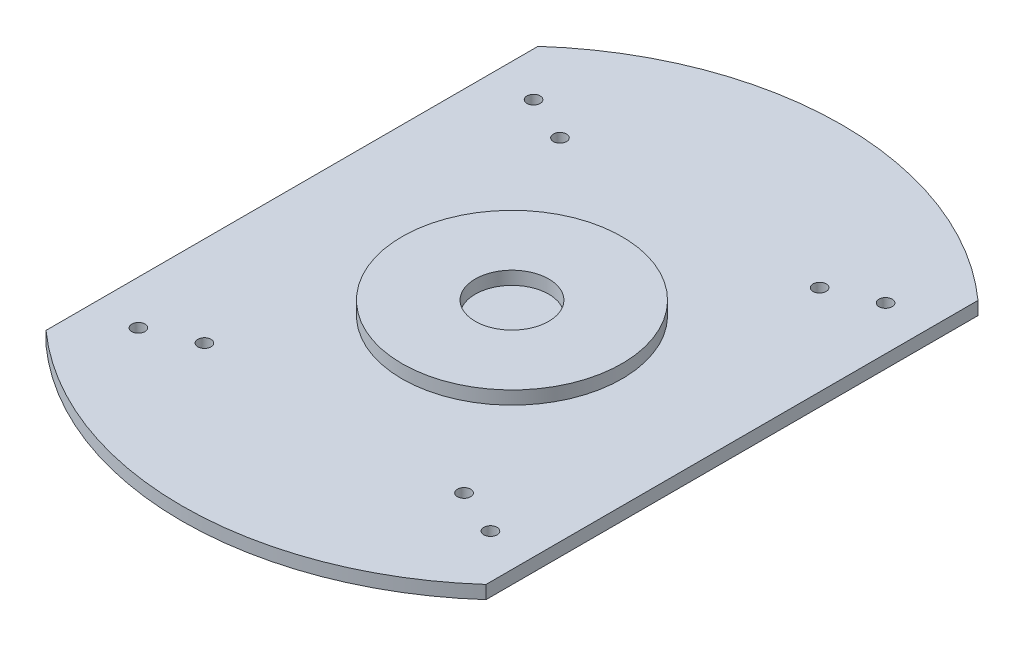
ISO-10303-21;
HEADER;
FILE_DESCRIPTION(('STEP AP214'),'2;1');
FILE_NAME('part.step','',(''),(''),'','','');
FILE_SCHEMA(('AUTOMOTIVE_DESIGN { 1 0 10303 214 1 1 1 1 }'));
ENDSEC;
DATA;
#1=APPLICATION_CONTEXT('core data for automotive mechanical design processes');
#2=APPLICATION_PROTOCOL_DEFINITION('international standard','automotive_design',2000,#1);
#3=PRODUCT_CONTEXT('',#1,'mechanical');
#4=PRODUCT('Part','Part','',(#3));
#5=PRODUCT_RELATED_PRODUCT_CATEGORY('part','',(#4));
#6=PRODUCT_DEFINITION_FORMATION('','',#4);
#7=PRODUCT_DEFINITION_CONTEXT('part definition',#1,'design');
#8=PRODUCT_DEFINITION('design','',#6,#7);
#9=PRODUCT_DEFINITION_SHAPE('','',#8);
#10=(LENGTH_UNIT() NAMED_UNIT(*) SI_UNIT(.MILLI.,.METRE.));
#11=(NAMED_UNIT(*) PLANE_ANGLE_UNIT() SI_UNIT($,.RADIAN.));
#12=(NAMED_UNIT(*) SI_UNIT($,.STERADIAN.) SOLID_ANGLE_UNIT());
#13=UNCERTAINTY_MEASURE_WITH_UNIT(LENGTH_MEASURE(1.E-05),#10,'distance_accuracy_value','');
#14=(GEOMETRIC_REPRESENTATION_CONTEXT(3) GLOBAL_UNCERTAINTY_ASSIGNED_CONTEXT((#13)) GLOBAL_UNIT_ASSIGNED_CONTEXT((#10,
#11,#12)) REPRESENTATION_CONTEXT('',''));
#15=CARTESIAN_POINT('',(0.,0.,0.));
#16=DIRECTION('',(0.,0.,1.));
#17=DIRECTION('',(1.,0.,0.));
#18=AXIS2_PLACEMENT_3D('',#15,#16,#17);
#19=CARTESIAN_POINT('',(50.,3.,0.));
#20=DIRECTION('',(-1.,0.,0.));
#21=DIRECTION('',(0.,0.,1.));
#22=AXIS2_PLACEMENT_3D('',#19,#20,#21);
#23=PLANE('',#22);
#24=DIRECTION('',(0.,0.,-1.));
#25=VECTOR('',#24,1.);
#26=CARTESIAN_POINT('',(50.,0.,0.));
#27=LINE('',#26,#25);
#28=CARTESIAN_POINT('',(50.,0.,55.9016994374947));
#29=VERTEX_POINT('',#28);
#30=CARTESIAN_POINT('',(50.,0.,-55.9016994374947));
#31=VERTEX_POINT('',#30);
#32=EDGE_CURVE('E148',#29,#31,#27,.T.);
#33=ORIENTED_EDGE('',*,*,#32,.T.);
#34=DIRECTION('',(0.,-1.,0.));
#35=VECTOR('',#34,1.);
#36=CARTESIAN_POINT('',(50.,3.,-55.9016994374947));
#37=LINE('',#36,#35);
#38=CARTESIAN_POINT('',(50.,3.,-55.9016994374947));
#39=VERTEX_POINT('',#38);
#40=EDGE_CURVE('E53',#39,#31,#37,.T.);
#41=ORIENTED_EDGE('',*,*,#40,.F.);
#42=DIRECTION('',(0.,0.,-1.));
#43=VECTOR('',#42,1.);
#44=CARTESIAN_POINT('',(50.,3.,0.));
#45=LINE('',#44,#43);
#46=CARTESIAN_POINT('',(50.,3.,55.9016994374947));
#47=VERTEX_POINT('',#46);
#48=EDGE_CURVE('E94',#47,#39,#45,.T.);
#49=ORIENTED_EDGE('',*,*,#48,.F.);
#50=DIRECTION('',(0.,-1.,0.));
#51=VECTOR('',#50,1.);
#52=CARTESIAN_POINT('',(50.,3.,55.9016994374947));
#53=LINE('',#52,#51);
#54=EDGE_CURVE('E122',#47,#29,#53,.T.);
#55=ORIENTED_EDGE('',*,*,#54,.T.);
#56=EDGE_LOOP('',(#33,#41,#49,#55));
#57=FACE_BOUND('',#56,.T.);
#58=ADVANCED_FACE('F43',(#57),#23,.F.);
#59=CARTESIAN_POINT('',(0.,3.,0.));
#60=DIRECTION('',(0.,-1.,0.));
#61=DIRECTION('',(0.,0.,-1.));
#62=AXIS2_PLACEMENT_3D('',#59,#60,#61);
#63=CYLINDRICAL_SURFACE('',#62,75.);
#64=CARTESIAN_POINT('',(0.,0.,0.));
#65=DIRECTION('',(0.,1.,0.));
#66=DIRECTION('',(0.,0.,1.));
#67=AXIS2_PLACEMENT_3D('',#64,#65,#66);
#68=CIRCLE('',#67,75.);
#69=CARTESIAN_POINT('',(-50.,0.,-55.9016994374947));
#70=VERTEX_POINT('',#69);
#71=EDGE_CURVE('E101',#31,#70,#68,.T.);
#72=ORIENTED_EDGE('',*,*,#71,.T.);
#73=DIRECTION('',(0.,-1.,0.));
#74=VECTOR('',#73,1.);
#75=CARTESIAN_POINT('',(-50.,3.,-55.9016994374947));
#76=LINE('',#75,#74);
#77=CARTESIAN_POINT('',(-50.,3.,-55.9016994374947));
#78=VERTEX_POINT('',#77);
#79=EDGE_CURVE('E99',#78,#70,#76,.T.);
#80=ORIENTED_EDGE('',*,*,#79,.F.);
#81=CARTESIAN_POINT('',(0.,3.,0.));
#82=DIRECTION('',(0.,1.,0.));
#83=DIRECTION('',(0.,0.,1.));
#84=AXIS2_PLACEMENT_3D('',#81,#82,#83);
#85=CIRCLE('',#84,75.);
#86=EDGE_CURVE('E88',#39,#78,#85,.T.);
#87=ORIENTED_EDGE('',*,*,#86,.F.);
#88=ORIENTED_EDGE('',*,*,#40,.T.);
#89=EDGE_LOOP('',(#72,#80,#87,#88));
#90=FACE_BOUND('',#89,.T.);
#91=ADVANCED_FACE('F100',(#90),#63,.T.);
#92=CARTESIAN_POINT('',(-50.,3.,0.));
#93=DIRECTION('',(-1.,0.,0.));
#94=DIRECTION('',(0.,0.,1.));
#95=AXIS2_PLACEMENT_3D('',#92,#93,#94);
#96=PLANE('',#95);
#97=DIRECTION('',(0.,0.,-1.));
#98=VECTOR('',#97,1.);
#99=CARTESIAN_POINT('',(-50.,0.,0.));
#100=LINE('',#99,#98);
#101=CARTESIAN_POINT('',(-50.,0.,55.9016994374947));
#102=VERTEX_POINT('',#101);
#103=EDGE_CURVE('E154',#102,#70,#100,.T.);
#104=ORIENTED_EDGE('',*,*,#103,.F.);
#105=DIRECTION('',(0.,-1.,0.));
#106=VECTOR('',#105,1.);
#107=CARTESIAN_POINT('',(-50.,3.,55.9016994374947));
#108=LINE('',#107,#106);
#109=CARTESIAN_POINT('',(-50.,3.,55.9016994374947));
#110=VERTEX_POINT('',#109);
#111=EDGE_CURVE('E77',#110,#102,#108,.T.);
#112=ORIENTED_EDGE('',*,*,#111,.F.);
#113=DIRECTION('',(0.,0.,-1.));
#114=VECTOR('',#113,1.);
#115=CARTESIAN_POINT('',(-50.,3.,0.));
#116=LINE('',#115,#114);
#117=EDGE_CURVE('E92',#110,#78,#116,.T.);
#118=ORIENTED_EDGE('',*,*,#117,.T.);
#119=ORIENTED_EDGE('',*,*,#79,.T.);
#120=EDGE_LOOP('',(#104,#112,#118,#119));
#121=FACE_BOUND('',#120,.T.);
#122=ADVANCED_FACE('F107',(#121),#96,.T.);
#123=CARTESIAN_POINT('',(-40.,3.,-44.9));
#124=DIRECTION('',(0.,-1.,0.));
#125=DIRECTION('',(0.,0.,-1.));
#126=AXIS2_PLACEMENT_3D('',#123,#124,#125);
#127=CYLINDRICAL_SURFACE('',#126,1.5);
#128=CARTESIAN_POINT('',(-40.,3.,-44.9));
#129=DIRECTION('',(0.,1.,0.));
#130=DIRECTION('',(0.,0.,1.));
#131=AXIS2_PLACEMENT_3D('',#128,#129,#130);
#132=CIRCLE('',#131,1.5);
#133=CARTESIAN_POINT('',(-40.,3.,-43.4));
#134=VERTEX_POINT('',#133);
#135=EDGE_CURVE('E111',#134,#134,#132,.F.);
#136=ORIENTED_EDGE('',*,*,#135,.F.);
#137=EDGE_LOOP('',(#136));
#138=FACE_BOUND('',#137,.T.);
#139=CARTESIAN_POINT('',(-40.,0.,-44.9));
#140=DIRECTION('',(0.,1.,0.));
#141=DIRECTION('',(0.,0.,1.));
#142=AXIS2_PLACEMENT_3D('',#139,#140,#141);
#143=CIRCLE('',#142,1.5);
#144=CARTESIAN_POINT('',(-40.,0.,-43.4));
#145=VERTEX_POINT('',#144);
#146=EDGE_CURVE('E159',#145,#145,#143,.F.);
#147=ORIENTED_EDGE('',*,*,#146,.T.);
#148=EDGE_LOOP('',(#147));
#149=FACE_BOUND('',#148,.T.);
#150=ADVANCED_FACE('F382',(#138,#149),#127,.F.);
#151=CARTESIAN_POINT('',(0.,3.,0.));
#152=DIRECTION('',(0.,-1.,0.));
#153=DIRECTION('',(0.,0.,-1.));
#154=AXIS2_PLACEMENT_3D('',#151,#152,#153);
#155=CYLINDRICAL_SURFACE('',#154,75.);
#156=CARTESIAN_POINT('',(0.,0.,0.));
#157=DIRECTION('',(0.,1.,0.));
#158=DIRECTION('',(0.,0.,1.));
#159=AXIS2_PLACEMENT_3D('',#156,#157,#158);
#160=CIRCLE('',#159,75.);
#161=EDGE_CURVE('E80',#102,#29,#160,.T.);
#162=ORIENTED_EDGE('',*,*,#161,.T.);
#163=ORIENTED_EDGE('',*,*,#54,.F.);
#164=CARTESIAN_POINT('',(0.,3.,0.));
#165=DIRECTION('',(0.,1.,0.));
#166=DIRECTION('',(0.,0.,1.));
#167=AXIS2_PLACEMENT_3D('',#164,#165,#166);
#168=CIRCLE('',#167,75.);
#169=EDGE_CURVE('E61',#110,#47,#168,.T.);
#170=ORIENTED_EDGE('',*,*,#169,.F.);
#171=ORIENTED_EDGE('',*,*,#111,.T.);
#172=EDGE_LOOP('',(#162,#163,#170,#171));
#173=FACE_BOUND('',#172,.T.);
#174=ADVANCED_FACE('F212',(#173),#155,.T.);
#175=CARTESIAN_POINT('',(40.,3.,-44.9));
#176=DIRECTION('',(0.,-1.,0.));
#177=DIRECTION('',(0.,0.,-1.));
#178=AXIS2_PLACEMENT_3D('',#175,#176,#177);
#179=CYLINDRICAL_SURFACE('',#178,1.5);
#180=CARTESIAN_POINT('',(40.,3.,-44.9));
#181=DIRECTION('',(0.,1.,0.));
#182=DIRECTION('',(0.,0.,1.));
#183=AXIS2_PLACEMENT_3D('',#180,#181,#182);
#184=CIRCLE('',#183,1.5);
#185=CARTESIAN_POINT('',(40.,3.,-43.4));
#186=VERTEX_POINT('',#185);
#187=EDGE_CURVE('E266',#186,#186,#184,.T.);
#188=ORIENTED_EDGE('',*,*,#187,.T.);
#189=EDGE_LOOP('',(#188));
#190=FACE_BOUND('',#189,.T.);
#191=CARTESIAN_POINT('',(40.,0.,-44.9));
#192=DIRECTION('',(0.,1.,0.));
#193=DIRECTION('',(0.,0.,1.));
#194=AXIS2_PLACEMENT_3D('',#191,#192,#193);
#195=CIRCLE('',#194,1.5);
#196=CARTESIAN_POINT('',(40.,0.,-43.4));
#197=VERTEX_POINT('',#196);
#198=EDGE_CURVE('E144',#197,#197,#195,.T.);
#199=ORIENTED_EDGE('',*,*,#198,.F.);
#200=EDGE_LOOP('',(#199));
#201=FACE_BOUND('',#200,.T.);
#202=ADVANCED_FACE('F208',(#190,#201),#179,.F.);
#203=CARTESIAN_POINT('',(29.5,3.,-40.4));
#204=DIRECTION('',(0.,-1.,0.));
#205=DIRECTION('',(0.,0.,-1.));
#206=AXIS2_PLACEMENT_3D('',#203,#204,#205);
#207=CYLINDRICAL_SURFACE('',#206,1.5);
#208=CARTESIAN_POINT('',(29.5,3.,-40.4));
#209=DIRECTION('',(0.,1.,0.));
#210=DIRECTION('',(0.,0.,1.));
#211=AXIS2_PLACEMENT_3D('',#208,#209,#210);
#212=CIRCLE('',#211,1.5);
#213=CARTESIAN_POINT('',(29.5,3.,-38.9));
#214=VERTEX_POINT('',#213);
#215=EDGE_CURVE('E262',#214,#214,#212,.T.);
#216=ORIENTED_EDGE('',*,*,#215,.T.);
#217=EDGE_LOOP('',(#216));
#218=FACE_BOUND('',#217,.T.);
#219=CARTESIAN_POINT('',(29.5,0.,-40.4));
#220=DIRECTION('',(0.,1.,0.));
#221=DIRECTION('',(0.,0.,1.));
#222=AXIS2_PLACEMENT_3D('',#219,#220,#221);
#223=CIRCLE('',#222,1.5);
#224=CARTESIAN_POINT('',(29.5,0.,-38.9));
#225=VERTEX_POINT('',#224);
#226=EDGE_CURVE('E140',#225,#225,#223,.T.);
#227=ORIENTED_EDGE('',*,*,#226,.F.);
#228=EDGE_LOOP('',(#227));
#229=FACE_BOUND('',#228,.T.);
#230=ADVANCED_FACE('F211',(#218,#229),#207,.F.);
#231=CARTESIAN_POINT('',(-29.5,3.,-40.4));
#232=DIRECTION('',(0.,-1.,0.));
#233=DIRECTION('',(0.,0.,-1.));
#234=AXIS2_PLACEMENT_3D('',#231,#232,#233);
#235=CYLINDRICAL_SURFACE('',#234,1.5);
#236=CARTESIAN_POINT('',(-29.5,3.,-40.4));
#237=DIRECTION('',(0.,1.,0.));
#238=DIRECTION('',(0.,0.,1.));
#239=AXIS2_PLACEMENT_3D('',#236,#237,#238);
#240=CIRCLE('',#239,1.5);
#241=CARTESIAN_POINT('',(-29.5,3.,-38.9));
#242=VERTEX_POINT('',#241);
#243=EDGE_CURVE('E253',#242,#242,#240,.F.);
#244=ORIENTED_EDGE('',*,*,#243,.F.);
#245=EDGE_LOOP('',(#244));
#246=FACE_BOUND('',#245,.T.);
#247=CARTESIAN_POINT('',(-29.5,0.,-40.4));
#248=DIRECTION('',(0.,1.,0.));
#249=DIRECTION('',(0.,0.,1.));
#250=AXIS2_PLACEMENT_3D('',#247,#248,#249);
#251=CIRCLE('',#250,1.5);
#252=CARTESIAN_POINT('',(-29.5,0.,-38.9));
#253=VERTEX_POINT('',#252);
#254=EDGE_CURVE('E136',#253,#253,#251,.F.);
#255=ORIENTED_EDGE('',*,*,#254,.T.);
#256=EDGE_LOOP('',(#255));
#257=FACE_BOUND('',#256,.T.);
#258=ADVANCED_FACE('F216',(#246,#257),#235,.F.);
#259=CARTESIAN_POINT('',(29.5,3.,40.4));
#260=DIRECTION('',(0.,-1.,0.));
#261=DIRECTION('',(0.,0.,-1.));
#262=AXIS2_PLACEMENT_3D('',#259,#260,#261);
#263=CYLINDRICAL_SURFACE('',#262,1.5);
#264=CARTESIAN_POINT('',(29.5,3.,40.4));
#265=DIRECTION('',(0.,1.,0.));
#266=DIRECTION('',(0.,0.,1.));
#267=AXIS2_PLACEMENT_3D('',#264,#265,#266);
#268=CIRCLE('',#267,1.5);
#269=CARTESIAN_POINT('',(29.5,3.,41.9));
#270=VERTEX_POINT('',#269);
#271=EDGE_CURVE('E248',#270,#270,#268,.F.);
#272=ORIENTED_EDGE('',*,*,#271,.F.);
#273=EDGE_LOOP('',(#272));
#274=FACE_BOUND('',#273,.T.);
#275=CARTESIAN_POINT('',(29.5,0.,40.4));
#276=DIRECTION('',(0.,1.,0.));
#277=DIRECTION('',(0.,0.,1.));
#278=AXIS2_PLACEMENT_3D('',#275,#276,#277);
#279=CIRCLE('',#278,1.5);
#280=CARTESIAN_POINT('',(29.5,0.,41.9));
#281=VERTEX_POINT('',#280);
#282=EDGE_CURVE('E132',#281,#281,#279,.F.);
#283=ORIENTED_EDGE('',*,*,#282,.T.);
#284=EDGE_LOOP('',(#283));
#285=FACE_BOUND('',#284,.T.);
#286=ADVANCED_FACE('F220',(#274,#285),#263,.F.);
#287=CARTESIAN_POINT('',(-29.5,3.,40.4));
#288=DIRECTION('',(0.,-1.,0.));
#289=DIRECTION('',(0.,0.,-1.));
#290=AXIS2_PLACEMENT_3D('',#287,#288,#289);
#291=CYLINDRICAL_SURFACE('',#290,1.5);
#292=CARTESIAN_POINT('',(-29.5,3.,40.4));
#293=DIRECTION('',(0.,1.,0.));
#294=DIRECTION('',(0.,0.,1.));
#295=AXIS2_PLACEMENT_3D('',#292,#293,#294);
#296=CIRCLE('',#295,1.5);
#297=CARTESIAN_POINT('',(-29.5,3.,41.9));
#298=VERTEX_POINT('',#297);
#299=EDGE_CURVE('E231',#298,#298,#296,.T.);
#300=ORIENTED_EDGE('',*,*,#299,.T.);
#301=EDGE_LOOP('',(#300));
#302=FACE_BOUND('',#301,.T.);
#303=CARTESIAN_POINT('',(-29.5,0.,40.4));
#304=DIRECTION('',(0.,1.,0.));
#305=DIRECTION('',(0.,0.,1.));
#306=AXIS2_PLACEMENT_3D('',#303,#304,#305);
#307=CIRCLE('',#306,1.5);
#308=CARTESIAN_POINT('',(-29.5,0.,41.9));
#309=VERTEX_POINT('',#308);
#310=EDGE_CURVE('E127',#309,#309,#307,.T.);
#311=ORIENTED_EDGE('',*,*,#310,.F.);
#312=EDGE_LOOP('',(#311));
#313=FACE_BOUND('',#312,.T.);
#314=ADVANCED_FACE('F196',(#302,#313),#291,.F.);
#315=CARTESIAN_POINT('',(-40.,3.,44.9));
#316=DIRECTION('',(0.,-1.,0.));
#317=DIRECTION('',(0.,0.,-1.));
#318=AXIS2_PLACEMENT_3D('',#315,#316,#317);
#319=CYLINDRICAL_SURFACE('',#318,1.5);
#320=CARTESIAN_POINT('',(-40.,3.,44.9));
#321=DIRECTION('',(0.,1.,0.));
#322=DIRECTION('',(0.,0.,1.));
#323=AXIS2_PLACEMENT_3D('',#320,#321,#322);
#324=CIRCLE('',#323,1.5);
#325=CARTESIAN_POINT('',(-40.,3.,46.4));
#326=VERTEX_POINT('',#325);
#327=EDGE_CURVE('E167',#326,#326,#324,.T.);
#328=ORIENTED_EDGE('',*,*,#327,.T.);
#329=EDGE_LOOP('',(#328));
#330=FACE_BOUND('',#329,.T.);
#331=CARTESIAN_POINT('',(-40.,0.,44.9));
#332=DIRECTION('',(0.,1.,0.));
#333=DIRECTION('',(0.,0.,1.));
#334=AXIS2_PLACEMENT_3D('',#331,#332,#333);
#335=CIRCLE('',#334,1.5);
#336=CARTESIAN_POINT('',(-40.,0.,46.4));
#337=VERTEX_POINT('',#336);
#338=EDGE_CURVE('E123',#337,#337,#335,.T.);
#339=ORIENTED_EDGE('',*,*,#338,.F.);
#340=EDGE_LOOP('',(#339));
#341=FACE_BOUND('',#340,.T.);
#342=ADVANCED_FACE('F45',(#330,#341),#319,.F.);
#343=CARTESIAN_POINT('',(40.,3.,44.9));
#344=DIRECTION('',(0.,-1.,0.));
#345=DIRECTION('',(0.,0.,-1.));
#346=AXIS2_PLACEMENT_3D('',#343,#344,#345);
#347=CYLINDRICAL_SURFACE('',#346,1.5);
#348=CARTESIAN_POINT('',(40.,3.,44.9));
#349=DIRECTION('',(0.,1.,0.));
#350=DIRECTION('',(0.,0.,1.));
#351=AXIS2_PLACEMENT_3D('',#348,#349,#350);
#352=CIRCLE('',#351,1.5);
#353=CARTESIAN_POINT('',(40.,3.,46.4));
#354=VERTEX_POINT('',#353);
#355=EDGE_CURVE('E118',#354,#354,#352,.F.);
#356=ORIENTED_EDGE('',*,*,#355,.F.);
#357=EDGE_LOOP('',(#356));
#358=FACE_BOUND('',#357,.T.);
#359=CARTESIAN_POINT('',(40.,0.,44.9));
#360=DIRECTION('',(0.,1.,0.));
#361=DIRECTION('',(0.,0.,1.));
#362=AXIS2_PLACEMENT_3D('',#359,#360,#361);
#363=CIRCLE('',#362,1.5);
#364=CARTESIAN_POINT('',(40.,0.,46.4));
#365=VERTEX_POINT('',#364);
#366=EDGE_CURVE('E163',#365,#365,#363,.F.);
#367=ORIENTED_EDGE('',*,*,#366,.T.);
#368=EDGE_LOOP('',(#367));
#369=FACE_BOUND('',#368,.T.);
#370=ADVANCED_FACE('F185',(#358,#369),#347,.F.);
#371=CARTESIAN_POINT('',(0.,3.,0.));
#372=DIRECTION('',(0.,1.,0.));
#373=DIRECTION('',(0.,0.,1.));
#374=AXIS2_PLACEMENT_3D('',#371,#372,#373);
#375=PLANE('',#374);
#376=CARTESIAN_POINT('',(0.,3.,0.));
#377=DIRECTION('',(0.,1.,0.));
#378=DIRECTION('',(0.,0.,1.));
#379=AXIS2_PLACEMENT_3D('',#376,#377,#378);
#380=CIRCLE('',#379,25.);
#381=CARTESIAN_POINT('',(0.,3.,25.));
#382=VERTEX_POINT('',#381);
#383=EDGE_CURVE('E276',#382,#382,#380,.T.);
#384=ORIENTED_EDGE('',*,*,#383,.F.);
#385=EDGE_LOOP('',(#384));
#386=FACE_BOUND('',#385,.T.);
#387=ORIENTED_EDGE('',*,*,#327,.F.);
#388=EDGE_LOOP('',(#387));
#389=FACE_BOUND('',#388,.T.);
#390=ORIENTED_EDGE('',*,*,#299,.F.);
#391=EDGE_LOOP('',(#390));
#392=FACE_BOUND('',#391,.T.);
#393=ORIENTED_EDGE('',*,*,#271,.T.);
#394=EDGE_LOOP('',(#393));
#395=FACE_BOUND('',#394,.T.);
#396=ORIENTED_EDGE('',*,*,#243,.T.);
#397=EDGE_LOOP('',(#396));
#398=FACE_BOUND('',#397,.T.);
#399=ORIENTED_EDGE('',*,*,#215,.F.);
#400=EDGE_LOOP('',(#399));
#401=FACE_BOUND('',#400,.T.);
#402=ORIENTED_EDGE('',*,*,#187,.F.);
#403=EDGE_LOOP('',(#402));
#404=FACE_BOUND('',#403,.T.);
#405=ORIENTED_EDGE('',*,*,#48,.T.);
#406=ORIENTED_EDGE('',*,*,#86,.T.);
#407=ORIENTED_EDGE('',*,*,#117,.F.);
#408=ORIENTED_EDGE('',*,*,#169,.T.);
#409=EDGE_LOOP('',(#405,#406,#407,#408));
#410=FACE_BOUND('',#409,.T.);
#411=ORIENTED_EDGE('',*,*,#135,.T.);
#412=EDGE_LOOP('',(#411));
#413=FACE_BOUND('',#412,.T.);
#414=ORIENTED_EDGE('',*,*,#355,.T.);
#415=EDGE_LOOP('',(#414));
#416=FACE_BOUND('',#415,.T.);
#417=ADVANCED_FACE('F89',(#386,#389,#392,#395,#398,#401,#404,#410,#413,#416),#375,.T.);
#418=CARTESIAN_POINT('',(0.,0.,0.));
#419=DIRECTION('',(0.,1.,0.));
#420=DIRECTION('',(0.,0.,1.));
#421=AXIS2_PLACEMENT_3D('',#418,#419,#420);
#422=PLANE('',#421);
#423=ORIENTED_EDGE('',*,*,#338,.T.);
#424=EDGE_LOOP('',(#423));
#425=FACE_BOUND('',#424,.T.);
#426=ORIENTED_EDGE('',*,*,#310,.T.);
#427=EDGE_LOOP('',(#426));
#428=FACE_BOUND('',#427,.T.);
#429=ORIENTED_EDGE('',*,*,#282,.F.);
#430=EDGE_LOOP('',(#429));
#431=FACE_BOUND('',#430,.T.);
#432=ORIENTED_EDGE('',*,*,#254,.F.);
#433=EDGE_LOOP('',(#432));
#434=FACE_BOUND('',#433,.T.);
#435=ORIENTED_EDGE('',*,*,#226,.T.);
#436=EDGE_LOOP('',(#435));
#437=FACE_BOUND('',#436,.T.);
#438=ORIENTED_EDGE('',*,*,#198,.T.);
#439=EDGE_LOOP('',(#438));
#440=FACE_BOUND('',#439,.T.);
#441=ORIENTED_EDGE('',*,*,#32,.F.);
#442=ORIENTED_EDGE('',*,*,#161,.F.);
#443=ORIENTED_EDGE('',*,*,#103,.T.);
#444=ORIENTED_EDGE('',*,*,#71,.F.);
#445=EDGE_LOOP('',(#441,#442,#443,#444));
#446=FACE_BOUND('',#445,.T.);
#447=ORIENTED_EDGE('',*,*,#146,.F.);
#448=EDGE_LOOP('',(#447));
#449=FACE_BOUND('',#448,.T.);
#450=ORIENTED_EDGE('',*,*,#366,.F.);
#451=EDGE_LOOP('',(#450));
#452=FACE_BOUND('',#451,.T.);
#453=ADVANCED_FACE('F175',(#425,#428,#431,#434,#437,#440,#446,#449,#452),#422,.F.);
#454=CARTESIAN_POINT('',(0.,6.,0.));
#455=DIRECTION('',(0.,1.,0.));
#456=DIRECTION('',(0.,0.,1.));
#457=AXIS2_PLACEMENT_3D('',#454,#455,#456);
#458=PLANE('',#457);
#459=CARTESIAN_POINT('',(0.,6.,0.));
#460=DIRECTION('',(0.,1.,0.));
#461=DIRECTION('',(0.,0.,1.));
#462=AXIS2_PLACEMENT_3D('',#459,#460,#461);
#463=CIRCLE('',#462,25.);
#464=CARTESIAN_POINT('',(0.,6.,25.));
#465=VERTEX_POINT('',#464);
#466=EDGE_CURVE('E128',#465,#465,#463,.T.);
#467=ORIENTED_EDGE('',*,*,#466,.T.);
#468=EDGE_LOOP('',(#467));
#469=FACE_BOUND('',#468,.T.);
#470=CARTESIAN_POINT('',(0.,6.,0.));
#471=DIRECTION('',(0.,1.,0.));
#472=DIRECTION('',(0.,0.,1.));
#473=AXIS2_PLACEMENT_3D('',#470,#471,#472);
#474=CIRCLE('',#473,8.35);
#475=CARTESIAN_POINT('',(0.,6.,8.35));
#476=VERTEX_POINT('',#475);
#477=EDGE_CURVE('E280',#476,#476,#474,.T.);
#478=ORIENTED_EDGE('',*,*,#477,.F.);
#479=EDGE_LOOP('',(#478));
#480=FACE_BOUND('',#479,.T.);
#481=ADVANCED_FACE('F178',(#469,#480),#458,.T.);
#482=CARTESIAN_POINT('',(0.,6.,0.));
#483=DIRECTION('',(0.,-1.,0.));
#484=DIRECTION('',(0.,0.,-1.));
#485=AXIS2_PLACEMENT_3D('',#482,#483,#484);
#486=CYLINDRICAL_SURFACE('',#485,25.);
#487=ORIENTED_EDGE('',*,*,#466,.F.);
#488=EDGE_LOOP('',(#487));
#489=FACE_BOUND('',#488,.T.);
#490=ORIENTED_EDGE('',*,*,#383,.T.);
#491=EDGE_LOOP('',(#490));
#492=FACE_BOUND('',#491,.T.);
#493=ADVANCED_FACE('F292',(#489,#492),#486,.T.);
#494=CARTESIAN_POINT('',(0.,6.,0.));
#495=DIRECTION('',(0.,-1.,0.));
#496=DIRECTION('',(0.,0.,-1.));
#497=AXIS2_PLACEMENT_3D('',#494,#495,#496);
#498=CYLINDRICAL_SURFACE('',#497,8.35);
#499=ORIENTED_EDGE('',*,*,#477,.T.);
#500=EDGE_LOOP('',(#499));
#501=FACE_BOUND('',#500,.T.);
#502=CARTESIAN_POINT('',(0.,3.,0.));
#503=DIRECTION('',(0.,1.,0.));
#504=DIRECTION('',(0.,0.,1.));
#505=AXIS2_PLACEMENT_3D('',#502,#503,#504);
#506=CIRCLE('',#505,8.35);
#507=CARTESIAN_POINT('',(0.,3.,8.35));
#508=VERTEX_POINT('',#507);
#509=EDGE_CURVE('E11',#508,#508,#506,.F.);
#510=ORIENTED_EDGE('',*,*,#509,.T.);
#511=EDGE_LOOP('',(#510));
#512=FACE_BOUND('',#511,.T.);
#513=ADVANCED_FACE('F288',(#501,#512),#498,.F.);
#514=ORIENTED_EDGE('',*,*,#509,.F.);
#515=EDGE_LOOP('',(#514));
#516=FACE_BOUND('',#515,.T.);
#517=ADVANCED_FACE('F195',(#516),#375,.T.);
#518=CLOSED_SHELL('',(#58,#91,#122,#150,#174,#202,#230,#258,#286,#314,#342,#370,#417,#453,#481,
#493,#513,#517));
#519=MANIFOLD_SOLID_BREP('B2',#518);
#520=ADVANCED_BREP_SHAPE_REPRESENTATION('',(#18,#519),#14);
#521=SHAPE_DEFINITION_REPRESENTATION(#9,#520);
ENDSEC;
END-ISO-10303-21;
